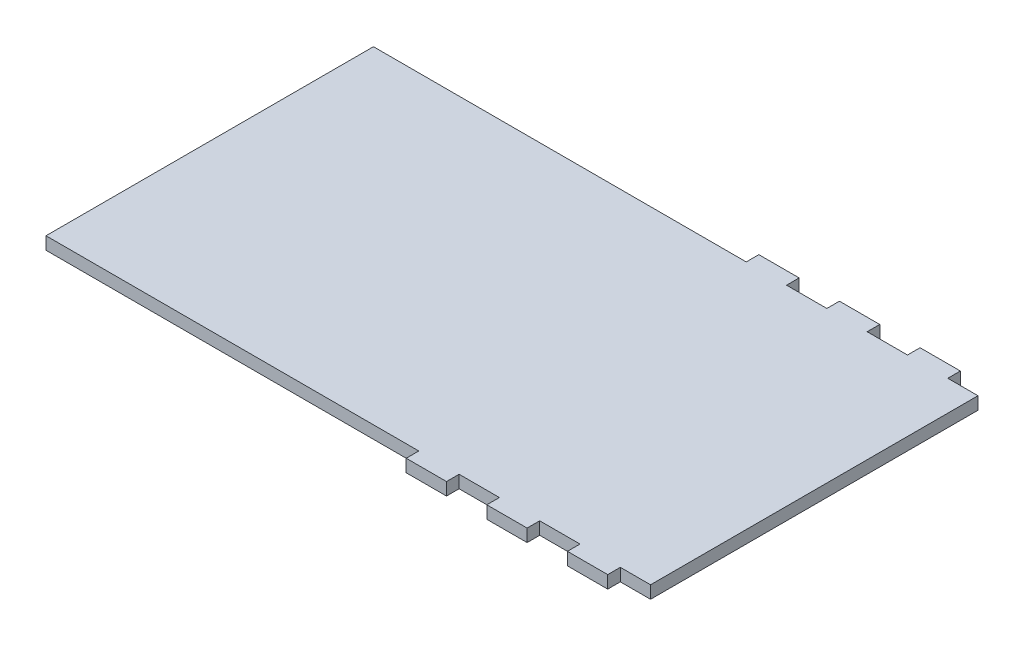
ISO-10303-21;
HEADER;
FILE_DESCRIPTION(('STEP AP214'),'2;1');
FILE_NAME('part.step','',(''),(''),'','','');
FILE_SCHEMA(('AUTOMOTIVE_DESIGN { 1 0 10303 214 1 1 1 1 }'));
ENDSEC;
DATA;
#1=APPLICATION_CONTEXT('core data for automotive mechanical design processes');
#2=APPLICATION_PROTOCOL_DEFINITION('international standard','automotive_design',2000,#1);
#3=PRODUCT_CONTEXT('',#1,'mechanical');
#4=PRODUCT('Part','Part','',(#3));
#5=PRODUCT_RELATED_PRODUCT_CATEGORY('part','',(#4));
#6=PRODUCT_DEFINITION_FORMATION('','',#4);
#7=PRODUCT_DEFINITION_CONTEXT('part definition',#1,'design');
#8=PRODUCT_DEFINITION('design','',#6,#7);
#9=PRODUCT_DEFINITION_SHAPE('','',#8);
#10=(LENGTH_UNIT() NAMED_UNIT(*) SI_UNIT(.MILLI.,.METRE.));
#11=(NAMED_UNIT(*) PLANE_ANGLE_UNIT() SI_UNIT($,.RADIAN.));
#12=(NAMED_UNIT(*) SI_UNIT($,.STERADIAN.) SOLID_ANGLE_UNIT());
#13=UNCERTAINTY_MEASURE_WITH_UNIT(LENGTH_MEASURE(1.E-05),#10,'distance_accuracy_value','');
#14=(GEOMETRIC_REPRESENTATION_CONTEXT(3) GLOBAL_UNCERTAINTY_ASSIGNED_CONTEXT((#13)) GLOBAL_UNIT_ASSIGNED_CONTEXT((#10,
#11,#12)) REPRESENTATION_CONTEXT('',''));
#15=CARTESIAN_POINT('',(0.,0.,0.));
#16=DIRECTION('',(0.,0.,1.));
#17=DIRECTION('',(1.,0.,0.));
#18=AXIS2_PLACEMENT_3D('',#15,#16,#17);
#19=CARTESIAN_POINT('',(-134.953730929585,3.175,41.275));
#20=DIRECTION('',(0.,0.,1.));
#21=DIRECTION('',(1.,0.,0.));
#22=AXIS2_PLACEMENT_3D('',#19,#20,#21);
#23=PLANE('',#22);
#24=DIRECTION('',(-1.,0.,0.));
#25=VECTOR('',#24,1.);
#26=CARTESIAN_POINT('',(-134.953730929585,0.,41.275));
#27=LINE('',#26,#25);
#28=CARTESIAN_POINT('',(38.1,0.,41.275));
#29=VERTEX_POINT('',#28);
#30=CARTESIAN_POINT('',(27.94,0.,41.275));
#31=VERTEX_POINT('',#30);
#32=EDGE_CURVE('E518',#29,#31,#27,.T.);
#33=ORIENTED_EDGE('',*,*,#32,.F.);
#34=DIRECTION('',(0.,-1.,0.));
#35=VECTOR('',#34,1.);
#36=CARTESIAN_POINT('',(38.1,3.175,41.275));
#37=LINE('',#36,#35);
#38=CARTESIAN_POINT('',(38.1,3.175,41.275));
#39=VERTEX_POINT('',#38);
#40=EDGE_CURVE('E431',#39,#29,#37,.T.);
#41=ORIENTED_EDGE('',*,*,#40,.F.);
#42=DIRECTION('',(-1.,0.,0.));
#43=VECTOR('',#42,1.);
#44=CARTESIAN_POINT('',(-134.953730929585,3.175,41.275));
#45=LINE('',#44,#43);
#46=CARTESIAN_POINT('',(27.94,3.175,41.275));
#47=VERTEX_POINT('',#46);
#48=EDGE_CURVE('E956',#39,#47,#45,.T.);
#49=ORIENTED_EDGE('',*,*,#48,.T.);
#50=DIRECTION('',(0.,-1.,0.));
#51=VECTOR('',#50,1.);
#52=CARTESIAN_POINT('',(27.94,3.175,41.275));
#53=LINE('',#52,#51);
#54=EDGE_CURVE('E434',#47,#31,#53,.T.);
#55=ORIENTED_EDGE('',*,*,#54,.T.);
#56=EDGE_LOOP('',(#33,#41,#49,#55));
#57=FACE_BOUND('',#56,.T.);
#58=ADVANCED_FACE('F215',(#57),#23,.T.);
#59=CARTESIAN_POINT('',(38.1,3.175,0.));
#60=DIRECTION('',(1.,0.,0.));
#61=DIRECTION('',(0.,0.,-1.));
#62=AXIS2_PLACEMENT_3D('',#59,#60,#61);
#63=PLANE('',#62);
#64=DIRECTION('',(0.,0.,1.));
#65=VECTOR('',#64,1.);
#66=CARTESIAN_POINT('',(38.1,0.,0.));
#67=LINE('',#66,#65);
#68=CARTESIAN_POINT('',(38.1,0.,44.45));
#69=VERTEX_POINT('',#68);
#70=EDGE_CURVE('E521',#29,#69,#67,.T.);
#71=ORIENTED_EDGE('',*,*,#70,.T.);
#72=DIRECTION('',(0.,-1.,0.));
#73=VECTOR('',#72,1.);
#74=CARTESIAN_POINT('',(38.1,3.175,44.45));
#75=LINE('',#74,#73);
#76=CARTESIAN_POINT('',(38.1,3.175,44.45));
#77=VERTEX_POINT('',#76);
#78=EDGE_CURVE('E428',#77,#69,#75,.T.);
#79=ORIENTED_EDGE('',*,*,#78,.F.);
#80=DIRECTION('',(0.,0.,1.));
#81=VECTOR('',#80,1.);
#82=CARTESIAN_POINT('',(38.1,3.175,0.));
#83=LINE('',#82,#81);
#84=EDGE_CURVE('E952',#39,#77,#83,.T.);
#85=ORIENTED_EDGE('',*,*,#84,.F.);
#86=ORIENTED_EDGE('',*,*,#40,.T.);
#87=EDGE_LOOP('',(#71,#79,#85,#86));
#88=FACE_BOUND('',#87,.T.);
#89=ADVANCED_FACE('F678',(#88),#63,.F.);
#90=CARTESIAN_POINT('',(-134.953730929585,3.175,44.45));
#91=DIRECTION('',(0.,0.,-1.));
#92=DIRECTION('',(-1.,0.,0.));
#93=AXIS2_PLACEMENT_3D('',#90,#91,#92);
#94=PLANE('',#93);
#95=DIRECTION('',(1.,0.,0.));
#96=VECTOR('',#95,1.);
#97=CARTESIAN_POINT('',(-134.953730929585,0.,44.45));
#98=LINE('',#97,#96);
#99=CARTESIAN_POINT('',(48.26,0.,44.45));
#100=VERTEX_POINT('',#99);
#101=EDGE_CURVE('E526',#69,#100,#98,.T.);
#102=ORIENTED_EDGE('',*,*,#101,.T.);
#103=DIRECTION('',(0.,-1.,0.));
#104=VECTOR('',#103,1.);
#105=CARTESIAN_POINT('',(48.26,3.175,44.45));
#106=LINE('',#105,#104);
#107=CARTESIAN_POINT('',(48.26,3.175,44.45));
#108=VERTEX_POINT('',#107);
#109=EDGE_CURVE('E425',#108,#100,#106,.T.);
#110=ORIENTED_EDGE('',*,*,#109,.F.);
#111=DIRECTION('',(1.,0.,0.));
#112=VECTOR('',#111,1.);
#113=CARTESIAN_POINT('',(-134.953730929585,3.175,44.45));
#114=LINE('',#113,#112);
#115=EDGE_CURVE('E945',#77,#108,#114,.T.);
#116=ORIENTED_EDGE('',*,*,#115,.F.);
#117=ORIENTED_EDGE('',*,*,#78,.T.);
#118=EDGE_LOOP('',(#102,#110,#116,#117));
#119=FACE_BOUND('',#118,.T.);
#120=ADVANCED_FACE('F681',(#119),#94,.F.);
#121=CARTESIAN_POINT('',(48.26,3.175,0.));
#122=DIRECTION('',(1.,0.,0.));
#123=DIRECTION('',(0.,0.,-1.));
#124=AXIS2_PLACEMENT_3D('',#121,#122,#123);
#125=PLANE('',#124);
#126=DIRECTION('',(0.,0.,1.));
#127=VECTOR('',#126,1.);
#128=CARTESIAN_POINT('',(48.26,0.,0.));
#129=LINE('',#128,#127);
#130=CARTESIAN_POINT('',(48.26,0.,41.275));
#131=VERTEX_POINT('',#130);
#132=EDGE_CURVE('E529',#131,#100,#129,.T.);
#133=ORIENTED_EDGE('',*,*,#132,.F.);
#134=DIRECTION('',(0.,-1.,0.));
#135=VECTOR('',#134,1.);
#136=CARTESIAN_POINT('',(48.26,3.175,41.275));
#137=LINE('',#136,#135);
#138=CARTESIAN_POINT('',(48.26,3.175,41.275));
#139=VERTEX_POINT('',#138);
#140=EDGE_CURVE('E422',#139,#131,#137,.T.);
#141=ORIENTED_EDGE('',*,*,#140,.F.);
#142=DIRECTION('',(0.,0.,1.));
#143=VECTOR('',#142,1.);
#144=CARTESIAN_POINT('',(48.26,3.175,0.));
#145=LINE('',#144,#143);
#146=EDGE_CURVE('E951',#139,#108,#145,.T.);
#147=ORIENTED_EDGE('',*,*,#146,.T.);
#148=ORIENTED_EDGE('',*,*,#109,.T.);
#149=EDGE_LOOP('',(#133,#141,#147,#148));
#150=FACE_BOUND('',#149,.T.);
#151=ADVANCED_FACE('F685',(#150),#125,.T.);
#152=CARTESIAN_POINT('',(58.42,0.,41.275));
#153=VERTEX_POINT('',#152);
#154=EDGE_CURVE('E522',#153,#131,#27,.T.);
#155=ORIENTED_EDGE('',*,*,#154,.F.);
#156=DIRECTION('',(0.,1.,0.));
#157=VECTOR('',#156,1.);
#158=CARTESIAN_POINT('',(58.42,3.175,41.275));
#159=LINE('',#158,#157);
#160=CARTESIAN_POINT('',(58.42,3.175,41.275));
#161=VERTEX_POINT('',#160);
#162=EDGE_CURVE('E12',#153,#161,#159,.T.);
#163=ORIENTED_EDGE('',*,*,#162,.T.);
#164=EDGE_CURVE('E954',#161,#139,#45,.T.);
#165=ORIENTED_EDGE('',*,*,#164,.T.);
#166=ORIENTED_EDGE('',*,*,#140,.T.);
#167=EDGE_LOOP('',(#155,#163,#165,#166));
#168=FACE_BOUND('',#167,.T.);
#169=ADVANCED_FACE('F689',(#168),#23,.T.);
#170=DIRECTION('',(0.,1.,0.));
#171=VECTOR('',#170,1.);
#172=CARTESIAN_POINT('',(68.58,3.175,41.275));
#173=LINE('',#172,#171);
#174=CARTESIAN_POINT('',(68.58,0.,41.275));
#175=VERTEX_POINT('',#174);
#176=CARTESIAN_POINT('',(68.58,3.175,41.275));
#177=VERTEX_POINT('',#176);
#178=EDGE_CURVE('E225',#175,#177,#173,.T.);
#179=ORIENTED_EDGE('',*,*,#178,.F.);
#180=CARTESIAN_POINT('',(76.2,0.,41.275));
#181=VERTEX_POINT('',#180);
#182=EDGE_CURVE('E523',#181,#175,#27,.T.);
#183=ORIENTED_EDGE('',*,*,#182,.F.);
#184=DIRECTION('',(0.,-1.,0.));
#185=VECTOR('',#184,1.);
#186=CARTESIAN_POINT('',(76.2,3.175,41.275));
#187=LINE('',#186,#185);
#188=CARTESIAN_POINT('',(76.2,3.175,41.275));
#189=VERTEX_POINT('',#188);
#190=EDGE_CURVE('E419',#189,#181,#187,.T.);
#191=ORIENTED_EDGE('',*,*,#190,.F.);
#192=EDGE_CURVE('E959',#189,#177,#45,.T.);
#193=ORIENTED_EDGE('',*,*,#192,.T.);
#194=EDGE_LOOP('',(#179,#183,#191,#193));
#195=FACE_BOUND('',#194,.T.);
#196=ADVANCED_FACE('F692',(#195),#23,.T.);
#197=CARTESIAN_POINT('',(76.2,3.175,0.));
#198=DIRECTION('',(-1.,0.,0.));
#199=DIRECTION('',(0.,0.,1.));
#200=AXIS2_PLACEMENT_3D('',#197,#198,#199);
#201=PLANE('',#200);
#202=DIRECTION('',(0.,0.,-1.));
#203=VECTOR('',#202,1.);
#204=CARTESIAN_POINT('',(76.2,0.,0.));
#205=LINE('',#204,#203);
#206=CARTESIAN_POINT('',(76.2,0.,-41.275));
#207=VERTEX_POINT('',#206);
#208=EDGE_CURVE('E358',#181,#207,#205,.T.);
#209=ORIENTED_EDGE('',*,*,#208,.T.);
#210=DIRECTION('',(0.,-1.,0.));
#211=VECTOR('',#210,1.);
#212=CARTESIAN_POINT('',(76.2,3.175,-41.275));
#213=LINE('',#212,#211);
#214=CARTESIAN_POINT('',(76.2,3.175,-41.275));
#215=VERTEX_POINT('',#214);
#216=EDGE_CURVE('E416',#215,#207,#213,.T.);
#217=ORIENTED_EDGE('',*,*,#216,.F.);
#218=DIRECTION('',(0.,0.,-1.));
#219=VECTOR('',#218,1.);
#220=CARTESIAN_POINT('',(76.2,3.175,0.));
#221=LINE('',#220,#219);
#222=EDGE_CURVE('E482',#189,#215,#221,.T.);
#223=ORIENTED_EDGE('',*,*,#222,.F.);
#224=ORIENTED_EDGE('',*,*,#190,.T.);
#225=EDGE_LOOP('',(#209,#217,#223,#224));
#226=FACE_BOUND('',#225,.T.);
#227=ADVANCED_FACE('F581',(#226),#201,.F.);
#228=CARTESIAN_POINT('',(-134.953730929585,3.175,-41.275));
#229=DIRECTION('',(0.,0.,1.));
#230=DIRECTION('',(1.,0.,0.));
#231=AXIS2_PLACEMENT_3D('',#228,#229,#230);
#232=PLANE('',#231);
#233=DIRECTION('',(-1.,0.,0.));
#234=VECTOR('',#233,1.);
#235=CARTESIAN_POINT('',(-134.953730929585,0.,-41.275));
#236=LINE('',#235,#234);
#237=CARTESIAN_POINT('',(68.5799999999997,0.,-41.275));
#238=VERTEX_POINT('',#237);
#239=EDGE_CURVE('E353',#207,#238,#236,.T.);
#240=ORIENTED_EDGE('',*,*,#239,.T.);
#241=DIRECTION('',(0.,1.,0.));
#242=VECTOR('',#241,1.);
#243=CARTESIAN_POINT('',(68.5799999999997,3.175,-41.275));
#244=LINE('',#243,#242);
#245=CARTESIAN_POINT('',(68.5799999999997,3.175,-41.275));
#246=VERTEX_POINT('',#245);
#247=EDGE_CURVE('E329',#238,#246,#244,.T.);
#248=ORIENTED_EDGE('',*,*,#247,.T.);
#249=DIRECTION('',(-1.,0.,0.));
#250=VECTOR('',#249,1.);
#251=CARTESIAN_POINT('',(-134.953730929585,3.175,-41.275));
#252=LINE('',#251,#250);
#253=EDGE_CURVE('E478',#215,#246,#252,.T.);
#254=ORIENTED_EDGE('',*,*,#253,.F.);
#255=ORIENTED_EDGE('',*,*,#216,.T.);
#256=EDGE_LOOP('',(#240,#248,#254,#255));
#257=FACE_BOUND('',#256,.T.);
#258=ADVANCED_FACE('F577',(#257),#232,.F.);
#259=CARTESIAN_POINT('',(58.4199999999997,3.175,-41.275));
#260=VERTEX_POINT('',#259);
#261=CARTESIAN_POINT('',(48.2599999999997,3.175,-41.275));
#262=VERTEX_POINT('',#261);
#263=EDGE_CURVE('E342',#260,#262,#252,.T.);
#264=ORIENTED_EDGE('',*,*,#263,.F.);
#265=DIRECTION('',(0.,-1.,0.));
#266=VECTOR('',#265,1.);
#267=CARTESIAN_POINT('',(58.4199999999997,3.175,-41.2750000000004));
#268=LINE('',#267,#266);
#269=CARTESIAN_POINT('',(58.4199999999997,0.,-41.275));
#270=VERTEX_POINT('',#269);
#271=EDGE_CURVE('E327',#260,#270,#268,.T.);
#272=ORIENTED_EDGE('',*,*,#271,.T.);
#273=CARTESIAN_POINT('',(48.2599999999997,0.,-41.275));
#274=VERTEX_POINT('',#273);
#275=EDGE_CURVE('E349',#270,#274,#236,.T.);
#276=ORIENTED_EDGE('',*,*,#275,.T.);
#277=DIRECTION('',(0.,1.,0.));
#278=VECTOR('',#277,1.);
#279=CARTESIAN_POINT('',(48.2599999999997,3.175,-41.275));
#280=LINE('',#279,#278);
#281=EDGE_CURVE('E347',#274,#262,#280,.T.);
#282=ORIENTED_EDGE('',*,*,#281,.T.);
#283=EDGE_LOOP('',(#264,#272,#276,#282));
#284=FACE_BOUND('',#283,.T.);
#285=ADVANCED_FACE('F352',(#284),#232,.F.);
#286=CARTESIAN_POINT('',(38.0999999999997,3.175,-41.275));
#287=VERTEX_POINT('',#286);
#288=CARTESIAN_POINT('',(27.9399999999997,3.175,-41.275));
#289=VERTEX_POINT('',#288);
#290=EDGE_CURVE('E489',#287,#289,#252,.T.);
#291=ORIENTED_EDGE('',*,*,#290,.F.);
#292=DIRECTION('',(0.,-1.,0.));
#293=VECTOR('',#292,1.);
#294=CARTESIAN_POINT('',(38.0999999999997,3.175,-41.275));
#295=LINE('',#294,#293);
#296=CARTESIAN_POINT('',(38.0999999999997,0.,-41.275));
#297=VERTEX_POINT('',#296);
#298=EDGE_CURVE('E219',#287,#297,#295,.T.);
#299=ORIENTED_EDGE('',*,*,#298,.T.);
#300=CARTESIAN_POINT('',(27.9399999999997,0.,-41.275));
#301=VERTEX_POINT('',#300);
#302=EDGE_CURVE('E295',#297,#301,#236,.T.);
#303=ORIENTED_EDGE('',*,*,#302,.T.);
#304=DIRECTION('',(0.,-1.,0.));
#305=VECTOR('',#304,1.);
#306=CARTESIAN_POINT('',(27.9399999999997,3.175,-41.275));
#307=LINE('',#306,#305);
#308=EDGE_CURVE('E413',#289,#301,#307,.T.);
#309=ORIENTED_EDGE('',*,*,#308,.F.);
#310=EDGE_LOOP('',(#291,#299,#303,#309));
#311=FACE_BOUND('',#310,.T.);
#312=ADVANCED_FACE('F632',(#311),#232,.F.);
#313=CARTESIAN_POINT('',(27.9399999999997,3.175,0.));
#314=DIRECTION('',(1.,0.,0.));
#315=DIRECTION('',(0.,0.,-1.));
#316=AXIS2_PLACEMENT_3D('',#313,#314,#315);
#317=PLANE('',#316);
#318=DIRECTION('',(0.,0.,1.));
#319=VECTOR('',#318,1.);
#320=CARTESIAN_POINT('',(27.9399999999997,0.,0.));
#321=LINE('',#320,#319);
#322=CARTESIAN_POINT('',(27.9399999999997,0.,-44.4499999999996));
#323=VERTEX_POINT('',#322);
#324=EDGE_CURVE('E357',#323,#301,#321,.T.);
#325=ORIENTED_EDGE('',*,*,#324,.F.);
#326=DIRECTION('',(0.,-1.,0.));
#327=VECTOR('',#326,1.);
#328=CARTESIAN_POINT('',(27.9399999999997,3.175,-44.4499999999996));
#329=LINE('',#328,#327);
#330=CARTESIAN_POINT('',(27.9399999999997,3.175,-44.4499999999996));
#331=VERTEX_POINT('',#330);
#332=EDGE_CURVE('E410',#331,#323,#329,.T.);
#333=ORIENTED_EDGE('',*,*,#332,.F.);
#334=DIRECTION('',(0.,0.,1.));
#335=VECTOR('',#334,1.);
#336=CARTESIAN_POINT('',(27.9399999999997,3.175,0.));
#337=LINE('',#336,#335);
#338=EDGE_CURVE('E487',#331,#289,#337,.T.);
#339=ORIENTED_EDGE('',*,*,#338,.T.);
#340=ORIENTED_EDGE('',*,*,#308,.T.);
#341=EDGE_LOOP('',(#325,#333,#339,#340));
#342=FACE_BOUND('',#341,.T.);
#343=ADVANCED_FACE('F629',(#342),#317,.T.);
#344=CARTESIAN_POINT('',(-134.953730929585,3.175,-44.4499999999996));
#345=DIRECTION('',(0.,0.,-1.));
#346=DIRECTION('',(-1.,0.,0.));
#347=AXIS2_PLACEMENT_3D('',#344,#345,#346);
#348=PLANE('',#347);
#349=DIRECTION('',(1.,0.,0.));
#350=VECTOR('',#349,1.);
#351=CARTESIAN_POINT('',(-134.953730929585,0.,-44.4499999999996));
#352=LINE('',#351,#350);
#353=CARTESIAN_POINT('',(17.7799999999997,0.,-44.4499999999996));
#354=VERTEX_POINT('',#353);
#355=EDGE_CURVE('E373',#354,#323,#352,.T.);
#356=ORIENTED_EDGE('',*,*,#355,.F.);
#357=DIRECTION('',(0.,-1.,0.));
#358=VECTOR('',#357,1.);
#359=CARTESIAN_POINT('',(17.7799999999997,3.175,-44.4499999999996));
#360=LINE('',#359,#358);
#361=CARTESIAN_POINT('',(17.7799999999997,3.175,-44.4499999999996));
#362=VERTEX_POINT('',#361);
#363=EDGE_CURVE('E408',#362,#354,#360,.T.);
#364=ORIENTED_EDGE('',*,*,#363,.F.);
#365=DIRECTION('',(1.,0.,0.));
#366=VECTOR('',#365,1.);
#367=CARTESIAN_POINT('',(-134.953730929585,3.175,-44.4499999999996));
#368=LINE('',#367,#366);
#369=EDGE_CURVE('E492',#362,#331,#368,.T.);
#370=ORIENTED_EDGE('',*,*,#369,.T.);
#371=ORIENTED_EDGE('',*,*,#332,.T.);
#372=EDGE_LOOP('',(#356,#364,#370,#371));
#373=FACE_BOUND('',#372,.T.);
#374=ADVANCED_FACE('F625',(#373),#348,.T.);
#375=CARTESIAN_POINT('',(17.7799999999997,3.175,0.));
#376=DIRECTION('',(1.,0.,0.));
#377=DIRECTION('',(0.,0.,-1.));
#378=AXIS2_PLACEMENT_3D('',#375,#376,#377);
#379=PLANE('',#378);
#380=DIRECTION('',(0.,0.,1.));
#381=VECTOR('',#380,1.);
#382=CARTESIAN_POINT('',(17.7799999999997,0.,0.));
#383=LINE('',#382,#381);
#384=CARTESIAN_POINT('',(17.7799999999997,0.,-41.275));
#385=VERTEX_POINT('',#384);
#386=EDGE_CURVE('E363',#354,#385,#383,.T.);
#387=ORIENTED_EDGE('',*,*,#386,.T.);
#388=DIRECTION('',(0.,-1.,0.));
#389=VECTOR('',#388,1.);
#390=CARTESIAN_POINT('',(17.7799999999997,3.175,-41.275));
#391=LINE('',#390,#389);
#392=CARTESIAN_POINT('',(17.7799999999997,3.175,-41.275));
#393=VERTEX_POINT('',#392);
#394=EDGE_CURVE('E406',#393,#385,#391,.T.);
#395=ORIENTED_EDGE('',*,*,#394,.F.);
#396=DIRECTION('',(0.,0.,1.));
#397=VECTOR('',#396,1.);
#398=CARTESIAN_POINT('',(17.7799999999997,3.175,0.));
#399=LINE('',#398,#397);
#400=EDGE_CURVE('E497',#362,#393,#399,.T.);
#401=ORIENTED_EDGE('',*,*,#400,.F.);
#402=ORIENTED_EDGE('',*,*,#363,.T.);
#403=EDGE_LOOP('',(#387,#395,#401,#402));
#404=FACE_BOUND('',#403,.T.);
#405=ADVANCED_FACE('F695',(#404),#379,.F.);
#406=CARTESIAN_POINT('',(-76.2,0.,-41.275));
#407=VERTEX_POINT('',#406);
#408=EDGE_CURVE('E355',#385,#407,#236,.T.);
#409=ORIENTED_EDGE('',*,*,#408,.T.);
#410=DIRECTION('',(0.,-1.,0.));
#411=VECTOR('',#410,1.);
#412=CARTESIAN_POINT('',(-76.2,3.175,-41.275));
#413=LINE('',#412,#411);
#414=CARTESIAN_POINT('',(-76.2,3.175,-41.275));
#415=VERTEX_POINT('',#414);
#416=EDGE_CURVE('E403',#415,#407,#413,.T.);
#417=ORIENTED_EDGE('',*,*,#416,.F.);
#418=EDGE_CURVE('E490',#393,#415,#252,.T.);
#419=ORIENTED_EDGE('',*,*,#418,.F.);
#420=ORIENTED_EDGE('',*,*,#394,.T.);
#421=EDGE_LOOP('',(#409,#417,#419,#420));
#422=FACE_BOUND('',#421,.T.);
#423=ADVANCED_FACE('F622',(#422),#232,.F.);
#424=CARTESIAN_POINT('',(-76.2,3.175,0.));
#425=DIRECTION('',(-1.,0.,0.));
#426=DIRECTION('',(0.,0.,1.));
#427=AXIS2_PLACEMENT_3D('',#424,#425,#426);
#428=PLANE('',#427);
#429=DIRECTION('',(0.,0.,-1.));
#430=VECTOR('',#429,1.);
#431=CARTESIAN_POINT('',(-76.2,0.,0.));
#432=LINE('',#431,#430);
#433=CARTESIAN_POINT('',(-76.2,0.,41.275));
#434=VERTEX_POINT('',#433);
#435=EDGE_CURVE('E362',#434,#407,#432,.T.);
#436=ORIENTED_EDGE('',*,*,#435,.F.);
#437=DIRECTION('',(0.,-1.,0.));
#438=VECTOR('',#437,1.);
#439=CARTESIAN_POINT('',(-76.2,3.175,41.275));
#440=LINE('',#439,#438);
#441=CARTESIAN_POINT('',(-76.2,3.175,41.275));
#442=VERTEX_POINT('',#441);
#443=EDGE_CURVE('E400',#442,#434,#440,.T.);
#444=ORIENTED_EDGE('',*,*,#443,.F.);
#445=DIRECTION('',(0.,0.,-1.));
#446=VECTOR('',#445,1.);
#447=CARTESIAN_POINT('',(-76.2,3.175,0.));
#448=LINE('',#447,#446);
#449=EDGE_CURVE('E496',#442,#415,#448,.T.);
#450=ORIENTED_EDGE('',*,*,#449,.T.);
#451=ORIENTED_EDGE('',*,*,#416,.T.);
#452=EDGE_LOOP('',(#436,#444,#450,#451));
#453=FACE_BOUND('',#452,.T.);
#454=ADVANCED_FACE('F621',(#453),#428,.T.);
#455=CARTESIAN_POINT('',(17.78,0.,41.275));
#456=VERTEX_POINT('',#455);
#457=EDGE_CURVE('E370',#456,#434,#27,.T.);
#458=ORIENTED_EDGE('',*,*,#457,.F.);
#459=DIRECTION('',(0.,-1.,0.));
#460=VECTOR('',#459,1.);
#461=CARTESIAN_POINT('',(17.78,3.175,41.275));
#462=LINE('',#461,#460);
#463=CARTESIAN_POINT('',(17.78,3.175,41.275));
#464=VERTEX_POINT('',#463);
#465=EDGE_CURVE('E397',#464,#456,#462,.T.);
#466=ORIENTED_EDGE('',*,*,#465,.F.);
#467=EDGE_CURVE('E503',#464,#442,#45,.T.);
#468=ORIENTED_EDGE('',*,*,#467,.T.);
#469=ORIENTED_EDGE('',*,*,#443,.T.);
#470=EDGE_LOOP('',(#458,#466,#468,#469));
#471=FACE_BOUND('',#470,.T.);
#472=ADVANCED_FACE('F549',(#471),#23,.T.);
#473=CARTESIAN_POINT('',(17.78,3.175,0.));
#474=DIRECTION('',(1.,0.,0.));
#475=DIRECTION('',(0.,0.,-1.));
#476=AXIS2_PLACEMENT_3D('',#473,#474,#475);
#477=PLANE('',#476);
#478=DIRECTION('',(0.,0.,1.));
#479=VECTOR('',#478,1.);
#480=CARTESIAN_POINT('',(17.78,0.,0.));
#481=LINE('',#480,#479);
#482=CARTESIAN_POINT('',(17.78,0.,44.4500000000004));
#483=VERTEX_POINT('',#482);
#484=EDGE_CURVE('E383',#456,#483,#481,.T.);
#485=ORIENTED_EDGE('',*,*,#484,.T.);
#486=DIRECTION('',(0.,-1.,0.));
#487=VECTOR('',#486,1.);
#488=CARTESIAN_POINT('',(17.78,3.175,44.4500000000004));
#489=LINE('',#488,#487);
#490=CARTESIAN_POINT('',(17.78,3.175,44.4500000000004));
#491=VERTEX_POINT('',#490);
#492=EDGE_CURVE('E393',#491,#483,#489,.T.);
#493=ORIENTED_EDGE('',*,*,#492,.F.);
#494=DIRECTION('',(0.,0.,1.));
#495=VECTOR('',#494,1.);
#496=CARTESIAN_POINT('',(17.78,3.175,0.));
#497=LINE('',#496,#495);
#498=EDGE_CURVE('E512',#464,#491,#497,.T.);
#499=ORIENTED_EDGE('',*,*,#498,.F.);
#500=ORIENTED_EDGE('',*,*,#465,.T.);
#501=EDGE_LOOP('',(#485,#493,#499,#500));
#502=FACE_BOUND('',#501,.T.);
#503=ADVANCED_FACE('F706',(#502),#477,.F.);
#504=CARTESIAN_POINT('',(-134.953730929585,3.175,44.4500000000004));
#505=DIRECTION('',(0.,0.,-1.));
#506=DIRECTION('',(-1.,0.,0.));
#507=AXIS2_PLACEMENT_3D('',#504,#505,#506);
#508=PLANE('',#507);
#509=DIRECTION('',(1.,0.,0.));
#510=VECTOR('',#509,1.);
#511=CARTESIAN_POINT('',(-134.953730929585,0.,44.4500000000004));
#512=LINE('',#511,#510);
#513=CARTESIAN_POINT('',(27.94,0.,44.4500000000004));
#514=VERTEX_POINT('',#513);
#515=EDGE_CURVE('E386',#483,#514,#512,.T.);
#516=ORIENTED_EDGE('',*,*,#515,.T.);
#517=DIRECTION('',(0.,-1.,0.));
#518=VECTOR('',#517,1.);
#519=CARTESIAN_POINT('',(27.94,3.175,44.4500000000004));
#520=LINE('',#519,#518);
#521=CARTESIAN_POINT('',(27.94,3.175,44.4500000000004));
#522=VERTEX_POINT('',#521);
#523=EDGE_CURVE('E390',#522,#514,#520,.T.);
#524=ORIENTED_EDGE('',*,*,#523,.F.);
#525=DIRECTION('',(1.,0.,0.));
#526=VECTOR('',#525,1.);
#527=CARTESIAN_POINT('',(-134.953730929585,3.175,44.4500000000004));
#528=LINE('',#527,#526);
#529=EDGE_CURVE('E394',#491,#522,#528,.T.);
#530=ORIENTED_EDGE('',*,*,#529,.F.);
#531=ORIENTED_EDGE('',*,*,#492,.T.);
#532=EDGE_LOOP('',(#516,#524,#530,#531));
#533=FACE_BOUND('',#532,.T.);
#534=ADVANCED_FACE('F676',(#533),#508,.F.);
#535=CARTESIAN_POINT('',(27.94,3.175,0.));
#536=DIRECTION('',(1.,0.,0.));
#537=DIRECTION('',(0.,0.,-1.));
#538=AXIS2_PLACEMENT_3D('',#535,#536,#537);
#539=PLANE('',#538);
#540=DIRECTION('',(0.,0.,1.));
#541=VECTOR('',#540,1.);
#542=CARTESIAN_POINT('',(27.94,0.,0.));
#543=LINE('',#542,#541);
#544=EDGE_CURVE('E460',#31,#514,#543,.T.);
#545=ORIENTED_EDGE('',*,*,#544,.F.);
#546=ORIENTED_EDGE('',*,*,#54,.F.);
#547=DIRECTION('',(0.,0.,1.));
#548=VECTOR('',#547,1.);
#549=CARTESIAN_POINT('',(27.94,3.175,0.));
#550=LINE('',#549,#548);
#551=EDGE_CURVE('E389',#47,#522,#550,.T.);
#552=ORIENTED_EDGE('',*,*,#551,.T.);
#553=ORIENTED_EDGE('',*,*,#523,.T.);
#554=EDGE_LOOP('',(#545,#546,#552,#553));
#555=FACE_BOUND('',#554,.T.);
#556=ADVANCED_FACE('F673',(#555),#539,.T.);
#557=CARTESIAN_POINT('',(-134.953730929585,0.,0.));
#558=DIRECTION('',(0.,1.,0.));
#559=DIRECTION('',(0.,0.,1.));
#560=AXIS2_PLACEMENT_3D('',#557,#558,#559);
#561=PLANE('',#560);
#562=ORIENTED_EDGE('',*,*,#544,.T.);
#563=ORIENTED_EDGE('',*,*,#515,.F.);
#564=ORIENTED_EDGE('',*,*,#484,.F.);
#565=ORIENTED_EDGE('',*,*,#457,.T.);
#566=ORIENTED_EDGE('',*,*,#435,.T.);
#567=ORIENTED_EDGE('',*,*,#408,.F.);
#568=ORIENTED_EDGE('',*,*,#386,.F.);
#569=ORIENTED_EDGE('',*,*,#355,.T.);
#570=ORIENTED_EDGE('',*,*,#324,.T.);
#571=ORIENTED_EDGE('',*,*,#302,.F.);
#572=DIRECTION('',(0.,0.,1.));
#573=VECTOR('',#572,1.);
#574=CARTESIAN_POINT('',(38.0999999999997,0.,-44.45));
#575=LINE('',#574,#573);
#576=CARTESIAN_POINT('',(38.0999999999997,0.,-44.45));
#577=VERTEX_POINT('',#576);
#578=EDGE_CURVE('E281',#577,#297,#575,.T.);
#579=ORIENTED_EDGE('',*,*,#578,.F.);
#580=DIRECTION('',(1.,0.,0.));
#581=VECTOR('',#580,1.);
#582=CARTESIAN_POINT('',(38.0999999999997,0.,-44.45));
#583=LINE('',#582,#581);
#584=CARTESIAN_POINT('',(48.2599999999997,0.,-44.45));
#585=VERTEX_POINT('',#584);
#586=EDGE_CURVE('E292',#577,#585,#583,.T.);
#587=ORIENTED_EDGE('',*,*,#586,.T.);
#588=DIRECTION('',(0.,0.,1.));
#589=VECTOR('',#588,1.);
#590=CARTESIAN_POINT('',(48.2599999999997,0.,-44.45));
#591=LINE('',#590,#589);
#592=EDGE_CURVE('E296',#585,#274,#591,.T.);
#593=ORIENTED_EDGE('',*,*,#592,.T.);
#594=ORIENTED_EDGE('',*,*,#275,.F.);
#595=DIRECTION('',(0.,0.,1.));
#596=VECTOR('',#595,1.);
#597=CARTESIAN_POINT('',(58.4199999999997,0.,-44.4500000000004));
#598=LINE('',#597,#596);
#599=CARTESIAN_POINT('',(58.4199999999997,0.,-44.4500000000004));
#600=VERTEX_POINT('',#599);
#601=EDGE_CURVE('E303',#600,#270,#598,.T.);
#602=ORIENTED_EDGE('',*,*,#601,.F.);
#603=DIRECTION('',(1.,0.,0.));
#604=VECTOR('',#603,1.);
#605=CARTESIAN_POINT('',(58.4199999999997,0.,-44.4500000000004));
#606=LINE('',#605,#604);
#607=CARTESIAN_POINT('',(68.5799999999997,0.,-44.4500000000004));
#608=VERTEX_POINT('',#607);
#609=EDGE_CURVE('E313',#600,#608,#606,.T.);
#610=ORIENTED_EDGE('',*,*,#609,.T.);
#611=DIRECTION('',(0.,0.,1.));
#612=VECTOR('',#611,1.);
#613=CARTESIAN_POINT('',(68.5799999999997,0.,-44.4500000000004));
#614=LINE('',#613,#612);
#615=EDGE_CURVE('E305',#608,#238,#614,.T.);
#616=ORIENTED_EDGE('',*,*,#615,.T.);
#617=ORIENTED_EDGE('',*,*,#239,.F.);
#618=ORIENTED_EDGE('',*,*,#208,.F.);
#619=ORIENTED_EDGE('',*,*,#182,.T.);
#620=DIRECTION('',(0.,0.,1.));
#621=VECTOR('',#620,1.);
#622=CARTESIAN_POINT('',(68.58,0.,41.2749999999996));
#623=LINE('',#622,#621);
#624=CARTESIAN_POINT('',(68.58,0.,44.4499999999996));
#625=VERTEX_POINT('',#624);
#626=EDGE_CURVE('E326',#175,#625,#623,.T.);
#627=ORIENTED_EDGE('',*,*,#626,.T.);
#628=DIRECTION('',(1.,0.,0.));
#629=VECTOR('',#628,1.);
#630=CARTESIAN_POINT('',(58.42,0.,44.4499999999996));
#631=LINE('',#630,#629);
#632=CARTESIAN_POINT('',(58.42,0.,44.4499999999996));
#633=VERTEX_POINT('',#632);
#634=EDGE_CURVE('E453',#633,#625,#631,.T.);
#635=ORIENTED_EDGE('',*,*,#634,.F.);
#636=DIRECTION('',(0.,0.,1.));
#637=VECTOR('',#636,1.);
#638=CARTESIAN_POINT('',(58.42,0.,41.2749999999996));
#639=LINE('',#638,#637);
#640=EDGE_CURVE('E446',#153,#633,#639,.T.);
#641=ORIENTED_EDGE('',*,*,#640,.F.);
#642=ORIENTED_EDGE('',*,*,#154,.T.);
#643=ORIENTED_EDGE('',*,*,#132,.T.);
#644=ORIENTED_EDGE('',*,*,#101,.F.);
#645=ORIENTED_EDGE('',*,*,#70,.F.);
#646=ORIENTED_EDGE('',*,*,#32,.T.);
#647=EDGE_LOOP('',(#562,#563,#564,#565,#566,#567,#568,#569,#570,#571,#579,#587,#593,#594,#602,
#610,#616,#617,#618,#619,#627,#635,#641,#642,#643,#644,#645,#646));
#648=FACE_BOUND('',#647,.T.);
#649=ADVANCED_FACE('F290',(#648),#561,.F.);
#650=CARTESIAN_POINT('',(-134.953730929585,3.175,0.));
#651=DIRECTION('',(0.,1.,0.));
#652=DIRECTION('',(0.,0.,1.));
#653=AXIS2_PLACEMENT_3D('',#650,#651,#652);
#654=PLANE('',#653);
#655=ORIENTED_EDGE('',*,*,#551,.F.);
#656=ORIENTED_EDGE('',*,*,#48,.F.);
#657=ORIENTED_EDGE('',*,*,#84,.T.);
#658=ORIENTED_EDGE('',*,*,#115,.T.);
#659=ORIENTED_EDGE('',*,*,#146,.F.);
#660=ORIENTED_EDGE('',*,*,#164,.F.);
#661=DIRECTION('',(0.,0.,1.));
#662=VECTOR('',#661,1.);
#663=CARTESIAN_POINT('',(58.42,3.175,41.2749999999996));
#664=LINE('',#663,#662);
#665=CARTESIAN_POINT('',(58.42,3.175,44.4499999999996));
#666=VERTEX_POINT('',#665);
#667=EDGE_CURVE('E448',#161,#666,#664,.T.);
#668=ORIENTED_EDGE('',*,*,#667,.T.);
#669=DIRECTION('',(1.,0.,0.));
#670=VECTOR('',#669,1.);
#671=CARTESIAN_POINT('',(58.42,3.175,44.4499999999996));
#672=LINE('',#671,#670);
#673=CARTESIAN_POINT('',(68.58,3.175,44.4499999999996));
#674=VERTEX_POINT('',#673);
#675=EDGE_CURVE('E445',#666,#674,#672,.T.);
#676=ORIENTED_EDGE('',*,*,#675,.T.);
#677=DIRECTION('',(0.,0.,1.));
#678=VECTOR('',#677,1.);
#679=CARTESIAN_POINT('',(68.58,3.175,41.2749999999996));
#680=LINE('',#679,#678);
#681=EDGE_CURVE('E442',#177,#674,#680,.T.);
#682=ORIENTED_EDGE('',*,*,#681,.F.);
#683=ORIENTED_EDGE('',*,*,#192,.F.);
#684=ORIENTED_EDGE('',*,*,#222,.T.);
#685=ORIENTED_EDGE('',*,*,#253,.T.);
#686=DIRECTION('',(0.,0.,1.));
#687=VECTOR('',#686,1.);
#688=CARTESIAN_POINT('',(68.5799999999997,3.175,-44.4500000000004));
#689=LINE('',#688,#687);
#690=CARTESIAN_POINT('',(68.5799999999997,3.175,-44.4500000000004));
#691=VERTEX_POINT('',#690);
#692=EDGE_CURVE('E462',#691,#246,#689,.T.);
#693=ORIENTED_EDGE('',*,*,#692,.F.);
#694=DIRECTION('',(1.,0.,0.));
#695=VECTOR('',#694,1.);
#696=CARTESIAN_POINT('',(58.4199999999997,3.175,-44.4500000000004));
#697=LINE('',#696,#695);
#698=CARTESIAN_POINT('',(58.4199999999997,3.175,-44.4500000000004));
#699=VERTEX_POINT('',#698);
#700=EDGE_CURVE('E316',#699,#691,#697,.T.);
#701=ORIENTED_EDGE('',*,*,#700,.F.);
#702=DIRECTION('',(0.,0.,1.));
#703=VECTOR('',#702,1.);
#704=CARTESIAN_POINT('',(58.4199999999997,3.175,-44.4500000000004));
#705=LINE('',#704,#703);
#706=EDGE_CURVE('E321',#699,#260,#705,.T.);
#707=ORIENTED_EDGE('',*,*,#706,.T.);
#708=ORIENTED_EDGE('',*,*,#263,.T.);
#709=DIRECTION('',(0.,0.,1.));
#710=VECTOR('',#709,1.);
#711=CARTESIAN_POINT('',(48.2599999999997,3.175,-44.45));
#712=LINE('',#711,#710);
#713=CARTESIAN_POINT('',(48.2599999999997,3.175,-44.45));
#714=VERTEX_POINT('',#713);
#715=EDGE_CURVE('E300',#714,#262,#712,.T.);
#716=ORIENTED_EDGE('',*,*,#715,.F.);
#717=DIRECTION('',(1.,0.,0.));
#718=VECTOR('',#717,1.);
#719=CARTESIAN_POINT('',(38.0999999999997,3.175,-44.45));
#720=LINE('',#719,#718);
#721=CARTESIAN_POINT('',(38.0999999999997,3.175,-44.45));
#722=VERTEX_POINT('',#721);
#723=EDGE_CURVE('E285',#722,#714,#720,.T.);
#724=ORIENTED_EDGE('',*,*,#723,.F.);
#725=DIRECTION('',(0.,0.,1.));
#726=VECTOR('',#725,1.);
#727=CARTESIAN_POINT('',(38.0999999999997,3.175,-44.45));
#728=LINE('',#727,#726);
#729=EDGE_CURVE('E283',#722,#287,#728,.T.);
#730=ORIENTED_EDGE('',*,*,#729,.T.);
#731=ORIENTED_EDGE('',*,*,#290,.T.);
#732=ORIENTED_EDGE('',*,*,#338,.F.);
#733=ORIENTED_EDGE('',*,*,#369,.F.);
#734=ORIENTED_EDGE('',*,*,#400,.T.);
#735=ORIENTED_EDGE('',*,*,#418,.T.);
#736=ORIENTED_EDGE('',*,*,#449,.F.);
#737=ORIENTED_EDGE('',*,*,#467,.F.);
#738=ORIENTED_EDGE('',*,*,#498,.T.);
#739=ORIENTED_EDGE('',*,*,#529,.T.);
#740=EDGE_LOOP('',(#655,#656,#657,#658,#659,#660,#668,#676,#682,#683,#684,#685,#693,#701,#707,
#708,#716,#724,#730,#731,#732,#733,#734,#735,#736,#737,#738,#739));
#741=FACE_BOUND('',#740,.T.);
#742=ADVANCED_FACE('F336',(#741),#654,.T.);
#743=CARTESIAN_POINT('',(48.2599999999997,3.175,-44.45));
#744=DIRECTION('',(1.,0.,0.));
#745=DIRECTION('',(0.,0.,-1.));
#746=AXIS2_PLACEMENT_3D('',#743,#744,#745);
#747=PLANE('',#746);
#748=ORIENTED_EDGE('',*,*,#592,.F.);
#749=DIRECTION('',(0.,-1.,0.));
#750=VECTOR('',#749,1.);
#751=CARTESIAN_POINT('',(48.2599999999997,3.175,-44.45));
#752=LINE('',#751,#750);
#753=EDGE_CURVE('E275',#714,#585,#752,.T.);
#754=ORIENTED_EDGE('',*,*,#753,.F.);
#755=ORIENTED_EDGE('',*,*,#715,.T.);
#756=ORIENTED_EDGE('',*,*,#281,.F.);
#757=EDGE_LOOP('',(#748,#754,#755,#756));
#758=FACE_BOUND('',#757,.T.);
#759=ADVANCED_FACE('F345',(#758),#747,.T.);
#760=CARTESIAN_POINT('',(38.0999999999997,3.175,-44.45));
#761=DIRECTION('',(0.,0.,-1.));
#762=DIRECTION('',(-1.,0.,0.));
#763=AXIS2_PLACEMENT_3D('',#760,#761,#762);
#764=PLANE('',#763);
#765=ORIENTED_EDGE('',*,*,#586,.F.);
#766=DIRECTION('',(0.,-1.,0.));
#767=VECTOR('',#766,1.);
#768=CARTESIAN_POINT('',(38.0999999999997,3.175,-44.45));
#769=LINE('',#768,#767);
#770=EDGE_CURVE('E278',#722,#577,#769,.T.);
#771=ORIENTED_EDGE('',*,*,#770,.F.);
#772=ORIENTED_EDGE('',*,*,#723,.T.);
#773=ORIENTED_EDGE('',*,*,#753,.T.);
#774=EDGE_LOOP('',(#765,#771,#772,#773));
#775=FACE_BOUND('',#774,.T.);
#776=ADVANCED_FACE('F298',(#775),#764,.T.);
#777=CARTESIAN_POINT('',(38.0999999999997,3.175,-44.45));
#778=DIRECTION('',(1.,0.,0.));
#779=DIRECTION('',(0.,0.,-1.));
#780=AXIS2_PLACEMENT_3D('',#777,#778,#779);
#781=PLANE('',#780);
#782=ORIENTED_EDGE('',*,*,#578,.T.);
#783=ORIENTED_EDGE('',*,*,#298,.F.);
#784=ORIENTED_EDGE('',*,*,#729,.F.);
#785=ORIENTED_EDGE('',*,*,#770,.T.);
#786=EDGE_LOOP('',(#782,#783,#784,#785));
#787=FACE_BOUND('',#786,.T.);
#788=ADVANCED_FACE('F217',(#787),#781,.F.);
#789=CARTESIAN_POINT('',(68.5799999999997,3.175,-44.4500000000004));
#790=DIRECTION('',(1.,0.,0.));
#791=DIRECTION('',(0.,0.,-1.));
#792=AXIS2_PLACEMENT_3D('',#789,#790,#791);
#793=PLANE('',#792);
#794=ORIENTED_EDGE('',*,*,#615,.F.);
#795=DIRECTION('',(0.,-1.,0.));
#796=VECTOR('',#795,1.);
#797=CARTESIAN_POINT('',(68.5799999999997,3.175,-44.4500000000004));
#798=LINE('',#797,#796);
#799=EDGE_CURVE('E324',#691,#608,#798,.T.);
#800=ORIENTED_EDGE('',*,*,#799,.F.);
#801=ORIENTED_EDGE('',*,*,#692,.T.);
#802=ORIENTED_EDGE('',*,*,#247,.F.);
#803=EDGE_LOOP('',(#794,#800,#801,#802));
#804=FACE_BOUND('',#803,.T.);
#805=ADVANCED_FACE('F644',(#804),#793,.T.);
#806=CARTESIAN_POINT('',(58.4199999999997,3.175,-44.4500000000004));
#807=DIRECTION('',(0.,0.,-1.));
#808=DIRECTION('',(-1.,0.,0.));
#809=AXIS2_PLACEMENT_3D('',#806,#807,#808);
#810=PLANE('',#809);
#811=ORIENTED_EDGE('',*,*,#609,.F.);
#812=DIRECTION('',(0.,-1.,0.));
#813=VECTOR('',#812,1.);
#814=CARTESIAN_POINT('',(58.4199999999997,3.175,-44.4500000000004));
#815=LINE('',#814,#813);
#816=EDGE_CURVE('E322',#699,#600,#815,.T.);
#817=ORIENTED_EDGE('',*,*,#816,.F.);
#818=ORIENTED_EDGE('',*,*,#700,.T.);
#819=ORIENTED_EDGE('',*,*,#799,.T.);
#820=EDGE_LOOP('',(#811,#817,#818,#819));
#821=FACE_BOUND('',#820,.T.);
#822=ADVANCED_FACE('F473',(#821),#810,.T.);
#823=CARTESIAN_POINT('',(58.4199999999997,3.175,-44.4500000000004));
#824=DIRECTION('',(1.,0.,0.));
#825=DIRECTION('',(0.,0.,-1.));
#826=AXIS2_PLACEMENT_3D('',#823,#824,#825);
#827=PLANE('',#826);
#828=ORIENTED_EDGE('',*,*,#601,.T.);
#829=ORIENTED_EDGE('',*,*,#271,.F.);
#830=ORIENTED_EDGE('',*,*,#706,.F.);
#831=ORIENTED_EDGE('',*,*,#816,.T.);
#832=EDGE_LOOP('',(#828,#829,#830,#831));
#833=FACE_BOUND('',#832,.T.);
#834=ADVANCED_FACE('F575',(#833),#827,.F.);
#835=CARTESIAN_POINT('',(58.42,3.175,41.2749999999996));
#836=DIRECTION('',(1.,0.,0.));
#837=DIRECTION('',(0.,0.,-1.));
#838=AXIS2_PLACEMENT_3D('',#835,#836,#837);
#839=PLANE('',#838);
#840=ORIENTED_EDGE('',*,*,#640,.T.);
#841=DIRECTION('',(0.,-1.,0.));
#842=VECTOR('',#841,1.);
#843=CARTESIAN_POINT('',(58.42,3.175,44.4499999999996));
#844=LINE('',#843,#842);
#845=EDGE_CURVE('E457',#666,#633,#844,.T.);
#846=ORIENTED_EDGE('',*,*,#845,.F.);
#847=ORIENTED_EDGE('',*,*,#667,.F.);
#848=ORIENTED_EDGE('',*,*,#162,.F.);
#849=EDGE_LOOP('',(#840,#846,#847,#848));
#850=FACE_BOUND('',#849,.T.);
#851=ADVANCED_FACE('F658',(#850),#839,.F.);
#852=CARTESIAN_POINT('',(58.42,3.175,44.4499999999996));
#853=DIRECTION('',(0.,0.,-1.));
#854=DIRECTION('',(-1.,0.,0.));
#855=AXIS2_PLACEMENT_3D('',#852,#853,#854);
#856=PLANE('',#855);
#857=ORIENTED_EDGE('',*,*,#634,.T.);
#858=DIRECTION('',(0.,-1.,0.));
#859=VECTOR('',#858,1.);
#860=CARTESIAN_POINT('',(68.58,3.175,44.4499999999996));
#861=LINE('',#860,#859);
#862=EDGE_CURVE('E450',#674,#625,#861,.T.);
#863=ORIENTED_EDGE('',*,*,#862,.F.);
#864=ORIENTED_EDGE('',*,*,#675,.F.);
#865=ORIENTED_EDGE('',*,*,#845,.T.);
#866=EDGE_LOOP('',(#857,#863,#864,#865));
#867=FACE_BOUND('',#866,.T.);
#868=ADVANCED_FACE('F665',(#867),#856,.F.);
#869=CARTESIAN_POINT('',(68.58,3.175,41.2749999999996));
#870=DIRECTION('',(1.,0.,0.));
#871=DIRECTION('',(0.,0.,-1.));
#872=AXIS2_PLACEMENT_3D('',#869,#870,#871);
#873=PLANE('',#872);
#874=ORIENTED_EDGE('',*,*,#626,.F.);
#875=ORIENTED_EDGE('',*,*,#178,.T.);
#876=ORIENTED_EDGE('',*,*,#681,.T.);
#877=ORIENTED_EDGE('',*,*,#862,.T.);
#878=EDGE_LOOP('',(#874,#875,#876,#877));
#879=FACE_BOUND('',#878,.T.);
#880=ADVANCED_FACE('F662',(#879),#873,.T.);
#881=CLOSED_SHELL('',(#58,#89,#120,#151,#169,#196,#227,#258,#285,#312,#343,#374,#405,#423,#454,
#472,#503,#534,#556,#649,#742,#759,#776,#788,#805,#822,#834,#851,#868,#880));
#882=MANIFOLD_SOLID_BREP('B2',#881);
#883=ADVANCED_BREP_SHAPE_REPRESENTATION('',(#18,#882),#14);
#884=SHAPE_DEFINITION_REPRESENTATION(#9,#883);
ENDSEC;
END-ISO-10303-21;
